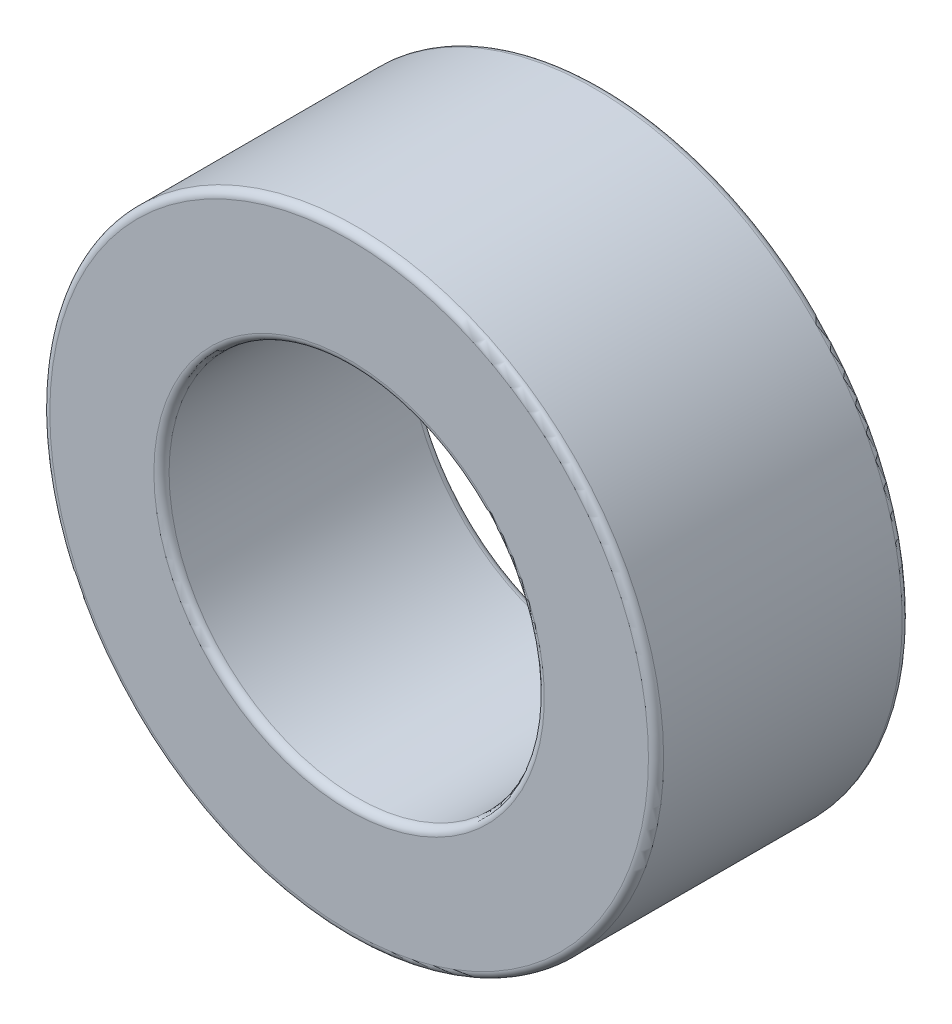
ISO-10303-21;
HEADER;
FILE_DESCRIPTION(('STEP AP214'),'2;1');
FILE_NAME('part.step','',(''),(''),'','','');
FILE_SCHEMA(('AUTOMOTIVE_DESIGN { 1 0 10303 214 1 1 1 1 }'));
ENDSEC;
DATA;
#1=APPLICATION_CONTEXT('core data for automotive mechanical design processes');
#2=APPLICATION_PROTOCOL_DEFINITION('international standard','automotive_design',2000,#1);
#3=PRODUCT_CONTEXT('',#1,'mechanical');
#4=PRODUCT('Part','Part','',(#3));
#5=PRODUCT_RELATED_PRODUCT_CATEGORY('part','',(#4));
#6=PRODUCT_DEFINITION_FORMATION('','',#4);
#7=PRODUCT_DEFINITION_CONTEXT('part definition',#1,'design');
#8=PRODUCT_DEFINITION('design','',#6,#7);
#9=PRODUCT_DEFINITION_SHAPE('','',#8);
#10=(LENGTH_UNIT() NAMED_UNIT(*) SI_UNIT(.MILLI.,.METRE.));
#11=(NAMED_UNIT(*) PLANE_ANGLE_UNIT() SI_UNIT($,.RADIAN.));
#12=(NAMED_UNIT(*) SI_UNIT($,.STERADIAN.) SOLID_ANGLE_UNIT());
#13=UNCERTAINTY_MEASURE_WITH_UNIT(LENGTH_MEASURE(1.E-05),#10,'distance_accuracy_value','');
#14=(GEOMETRIC_REPRESENTATION_CONTEXT(3) GLOBAL_UNCERTAINTY_ASSIGNED_CONTEXT((#13)) GLOBAL_UNIT_ASSIGNED_CONTEXT((#10,
#11,#12)) REPRESENTATION_CONTEXT('',''));
#15=CARTESIAN_POINT('',(0.,0.,0.));
#16=DIRECTION('',(0.,0.,1.));
#17=DIRECTION('',(1.,0.,0.));
#18=AXIS2_PLACEMENT_3D('',#15,#16,#17);
#19=CARTESIAN_POINT('',(-22.86,-8.89,-0.784999999999997));
#20=DIRECTION('',(0.,0.,1.));
#21=DIRECTION('',(1.,0.,0.));
#22=AXIS2_PLACEMENT_3D('',#19,#20,#21);
#23=TOROIDAL_SURFACE('',#22,1.285,0.0500000000000013);
#24=CARTESIAN_POINT('',(-22.86,-8.89,-0.785));
#25=DIRECTION('',(0.,0.,-1.));
#26=DIRECTION('',(-1.,0.,0.));
#27=AXIS2_PLACEMENT_3D('',#24,#25,#26);
#28=CIRCLE('',#27,1.235);
#29=CARTESIAN_POINT('',(-24.095,-8.89,-0.785));
#30=VERTEX_POINT('',#29);
#31=EDGE_CURVE('E37',#30,#30,#28,.T.);
#32=ORIENTED_EDGE('',*,*,#31,.F.);
#33=EDGE_LOOP('',(#32));
#34=FACE_BOUND('',#33,.T.);
#35=CARTESIAN_POINT('',(-22.86,-8.89,-0.834999999999998));
#36=DIRECTION('',(0.,0.,1.));
#37=DIRECTION('',(1.,0.,0.));
#38=AXIS2_PLACEMENT_3D('',#35,#36,#37);
#39=CIRCLE('',#38,1.285);
#40=CARTESIAN_POINT('',(-21.575,-8.89,-0.834999999999998));
#41=VERTEX_POINT('',#40);
#42=EDGE_CURVE('E18',#41,#41,#39,.T.);
#43=ORIENTED_EDGE('',*,*,#42,.F.);
#44=EDGE_LOOP('',(#43));
#45=FACE_BOUND('',#44,.T.);
#46=ADVANCED_FACE('F14',(#34,#45),#23,.T.);
#47=CARTESIAN_POINT('',(-22.86,-8.89,-0.785));
#48=DIRECTION('',(0.,0.,1.));
#49=DIRECTION('',(1.,0.,0.));
#50=AXIS2_PLACEMENT_3D('',#47,#48,#49);
#51=CYLINDRICAL_SURFACE('',#50,1.235);
#52=CARTESIAN_POINT('',(-22.86,-8.89,0.785));
#53=DIRECTION('',(0.,0.,-1.));
#54=DIRECTION('',(-1.,0.,0.));
#55=AXIS2_PLACEMENT_3D('',#52,#53,#54);
#56=CIRCLE('',#55,1.235);
#57=CARTESIAN_POINT('',(-24.095,-8.89,0.785));
#58=VERTEX_POINT('',#57);
#59=EDGE_CURVE('E33',#58,#58,#56,.T.);
#60=ORIENTED_EDGE('',*,*,#59,.F.);
#61=EDGE_LOOP('',(#60));
#62=FACE_BOUND('',#61,.T.);
#63=ORIENTED_EDGE('',*,*,#31,.T.);
#64=EDGE_LOOP('',(#63));
#65=FACE_BOUND('',#64,.T.);
#66=ADVANCED_FACE('F49',(#62,#65),#51,.F.);
#67=CARTESIAN_POINT('',(-20.89,-10.8994,-0.835));
#68=DIRECTION('',(0.,0.,-1.));
#69=DIRECTION('',(-1.,0.,0.));
#70=AXIS2_PLACEMENT_3D('',#67,#68,#69);
#71=PLANE('',#70);
#72=ORIENTED_EDGE('',*,*,#42,.T.);
#73=EDGE_LOOP('',(#72));
#74=FACE_BOUND('',#73,.T.);
#75=CARTESIAN_POINT('',(-22.86,-8.89,-0.834999999999999));
#76=DIRECTION('',(0.,0.,-1.));
#77=DIRECTION('',(-1.,0.,0.));
#78=AXIS2_PLACEMENT_3D('',#75,#76,#77);
#79=CIRCLE('',#78,1.97);
#80=CARTESIAN_POINT('',(-24.83,-8.89,-0.834999999999999));
#81=VERTEX_POINT('',#80);
#82=EDGE_CURVE('E36',#81,#81,#79,.F.);
#83=ORIENTED_EDGE('',*,*,#82,.F.);
#84=EDGE_LOOP('',(#83));
#85=FACE_BOUND('',#84,.T.);
#86=ADVANCED_FACE('F46',(#74,#85),#71,.T.);
#87=CARTESIAN_POINT('',(-22.86,-8.89,0.785));
#88=DIRECTION('',(0.,0.,-1.));
#89=DIRECTION('',(-1.,0.,0.));
#90=AXIS2_PLACEMENT_3D('',#87,#88,#89);
#91=TOROIDAL_SURFACE('',#90,1.28499999999999,0.0499999999999985);
#92=ORIENTED_EDGE('',*,*,#59,.T.);
#93=EDGE_LOOP('',(#92));
#94=FACE_BOUND('',#93,.T.);
#95=CARTESIAN_POINT('',(-22.86,-8.89,0.834999999999999));
#96=DIRECTION('',(0.,0.,-1.));
#97=DIRECTION('',(-1.,0.,0.));
#98=AXIS2_PLACEMENT_3D('',#95,#96,#97);
#99=CIRCLE('',#98,1.285);
#100=CARTESIAN_POINT('',(-24.145,-8.89,0.834999999999999));
#101=VERTEX_POINT('',#100);
#102=EDGE_CURVE('E32',#101,#101,#99,.T.);
#103=ORIENTED_EDGE('',*,*,#102,.F.);
#104=EDGE_LOOP('',(#103));
#105=FACE_BOUND('',#104,.T.);
#106=ADVANCED_FACE('F48',(#94,#105),#91,.T.);
#107=CARTESIAN_POINT('',(-22.86,-8.89,-0.785));
#108=DIRECTION('',(0.,0.,-1.));
#109=DIRECTION('',(-1.,0.,0.));
#110=AXIS2_PLACEMENT_3D('',#107,#108,#109);
#111=TOROIDAL_SURFACE('',#110,1.97,0.0499999999999985);
#112=CARTESIAN_POINT('',(-22.86,-8.89,-0.785));
#113=DIRECTION('',(0.,0.,1.));
#114=DIRECTION('',(1.,0.,0.));
#115=AXIS2_PLACEMENT_3D('',#112,#113,#114);
#116=CIRCLE('',#115,2.02);
#117=CARTESIAN_POINT('',(-20.84,-8.89,-0.785));
#118=VERTEX_POINT('',#117);
#119=EDGE_CURVE('E27',#118,#118,#116,.T.);
#120=ORIENTED_EDGE('',*,*,#119,.F.);
#121=EDGE_LOOP('',(#120));
#122=FACE_BOUND('',#121,.T.);
#123=ORIENTED_EDGE('',*,*,#82,.T.);
#124=EDGE_LOOP('',(#123));
#125=FACE_BOUND('',#124,.T.);
#126=ADVANCED_FACE('F44',(#122,#125),#111,.T.);
#127=CARTESIAN_POINT('',(-24.83,-10.8994,0.835));
#128=DIRECTION('',(0.,0.,1.));
#129=DIRECTION('',(1.,0.,0.));
#130=AXIS2_PLACEMENT_3D('',#127,#128,#129);
#131=PLANE('',#130);
#132=ORIENTED_EDGE('',*,*,#102,.T.);
#133=EDGE_LOOP('',(#132));
#134=FACE_BOUND('',#133,.T.);
#135=CARTESIAN_POINT('',(-22.86,-8.89,0.834999999999998));
#136=DIRECTION('',(0.,0.,1.));
#137=DIRECTION('',(0.,-1.,0.));
#138=AXIS2_PLACEMENT_3D('',#135,#136,#137);
#139=CIRCLE('',#138,1.97);
#140=CARTESIAN_POINT('',(-22.86,-10.86,0.834999999999997));
#141=VERTEX_POINT('',#140);
#142=EDGE_CURVE('E22',#141,#141,#139,.F.);
#143=ORIENTED_EDGE('',*,*,#142,.F.);
#144=EDGE_LOOP('',(#143));
#145=FACE_BOUND('',#144,.T.);
#146=ADVANCED_FACE('F67',(#134,#145),#131,.T.);
#147=CARTESIAN_POINT('',(-22.86,-8.89,0.785));
#148=DIRECTION('',(0.,0.,-1.));
#149=DIRECTION('',(-1.,0.,0.));
#150=AXIS2_PLACEMENT_3D('',#147,#148,#149);
#151=CYLINDRICAL_SURFACE('',#150,2.02);
#152=ORIENTED_EDGE('',*,*,#119,.T.);
#153=EDGE_LOOP('',(#152));
#154=FACE_BOUND('',#153,.T.);
#155=CARTESIAN_POINT('',(-22.86,-8.89,0.785));
#156=DIRECTION('',(0.,0.,1.));
#157=DIRECTION('',(1.,0.,0.));
#158=AXIS2_PLACEMENT_3D('',#155,#156,#157);
#159=CIRCLE('',#158,2.02);
#160=CARTESIAN_POINT('',(-20.84,-8.89,0.785));
#161=VERTEX_POINT('',#160);
#162=EDGE_CURVE('E10',#161,#161,#159,.T.);
#163=ORIENTED_EDGE('',*,*,#162,.F.);
#164=EDGE_LOOP('',(#163));
#165=FACE_BOUND('',#164,.T.);
#166=ADVANCED_FACE('F63',(#154,#165),#151,.T.);
#167=CARTESIAN_POINT('',(-22.86,-8.89,0.785));
#168=DIRECTION('',(0.,0.,1.));
#169=DIRECTION('',(0.,-1.,0.));
#170=AXIS2_PLACEMENT_3D('',#167,#168,#169);
#171=TOROIDAL_SURFACE('',#170,1.97000000000001,0.0499999999999974);
#172=ORIENTED_EDGE('',*,*,#162,.T.);
#173=EDGE_LOOP('',(#172));
#174=FACE_BOUND('',#173,.T.);
#175=ORIENTED_EDGE('',*,*,#142,.T.);
#176=EDGE_LOOP('',(#175));
#177=FACE_BOUND('',#176,.T.);
#178=ADVANCED_FACE('F16',(#174,#177),#171,.T.);
#179=CLOSED_SHELL('',(#46,#66,#86,#106,#126,#146,#166,#178));
#180=MANIFOLD_SOLID_BREP('B1',#179);
#181=ADVANCED_BREP_SHAPE_REPRESENTATION('',(#18,#180),#14);
#182=SHAPE_DEFINITION_REPRESENTATION(#9,#181);
ENDSEC;
END-ISO-10303-21;
